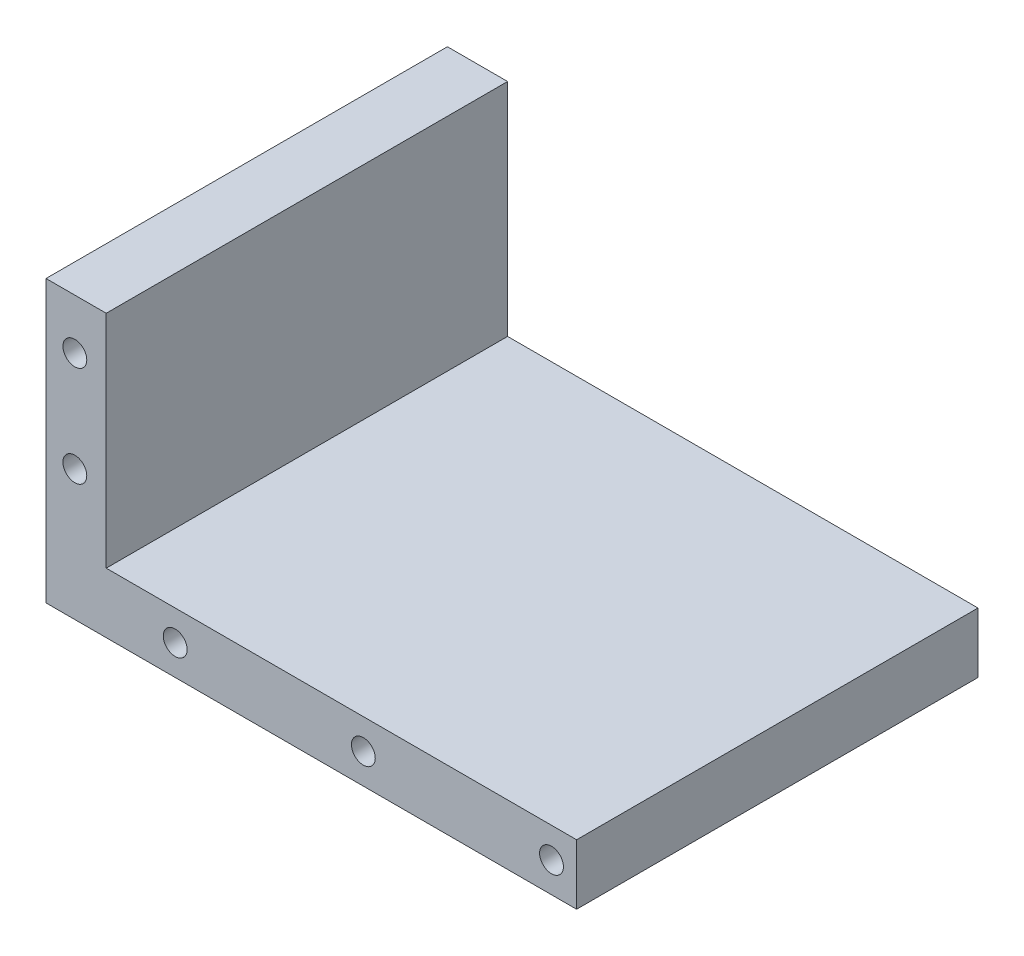
ISO-10303-21;
HEADER;
FILE_DESCRIPTION(('STEP AP214'),'2;1');
FILE_NAME('part.step','',(''),(''),'','','');
FILE_SCHEMA(('AUTOMOTIVE_DESIGN { 1 0 10303 214 1 1 1 1 }'));
ENDSEC;
DATA;
#1=APPLICATION_CONTEXT('core data for automotive mechanical design processes');
#2=APPLICATION_PROTOCOL_DEFINITION('international standard','automotive_design',2000,#1);
#3=PRODUCT_CONTEXT('',#1,'mechanical');
#4=PRODUCT('Part','Part','',(#3));
#5=PRODUCT_RELATED_PRODUCT_CATEGORY('part','',(#4));
#6=PRODUCT_DEFINITION_FORMATION('','',#4);
#7=PRODUCT_DEFINITION_CONTEXT('part definition',#1,'design');
#8=PRODUCT_DEFINITION('design','',#6,#7);
#9=PRODUCT_DEFINITION_SHAPE('','',#8);
#10=(LENGTH_UNIT() NAMED_UNIT(*) SI_UNIT(.MILLI.,.METRE.));
#11=(NAMED_UNIT(*) PLANE_ANGLE_UNIT() SI_UNIT($,.RADIAN.));
#12=(NAMED_UNIT(*) SI_UNIT($,.STERADIAN.) SOLID_ANGLE_UNIT());
#13=UNCERTAINTY_MEASURE_WITH_UNIT(LENGTH_MEASURE(1.E-05),#10,'distance_accuracy_value','');
#14=(GEOMETRIC_REPRESENTATION_CONTEXT(3) GLOBAL_UNCERTAINTY_ASSIGNED_CONTEXT((#13)) GLOBAL_UNIT_ASSIGNED_CONTEXT((#10,
#11,#12)) REPRESENTATION_CONTEXT('',''));
#15=CARTESIAN_POINT('',(0.,0.,0.));
#16=DIRECTION('',(0.,0.,1.));
#17=DIRECTION('',(1.,0.,0.));
#18=AXIS2_PLACEMENT_3D('',#15,#16,#17);
#19=CARTESIAN_POINT('',(0.,0.,32.));
#20=DIRECTION('',(0.,0.,-1.));
#21=DIRECTION('',(-1.,0.,0.));
#22=AXIS2_PLACEMENT_3D('',#19,#20,#21);
#23=PLANE('',#22);
#24=DIRECTION('',(-1.,0.,0.));
#25=VECTOR('',#24,1.);
#26=CARTESIAN_POINT('',(-4.8,17.6,32.));
#27=LINE('',#26,#25);
#28=CARTESIAN_POINT('',(0.,17.6,32.));
#29=VERTEX_POINT('',#28);
#30=CARTESIAN_POINT('',(-4.8,17.6,32.));
#31=VERTEX_POINT('',#30);
#32=EDGE_CURVE('E146',#29,#31,#27,.T.);
#33=ORIENTED_EDGE('',*,*,#32,.T.);
#34=DIRECTION('',(0.,-1.,0.));
#35=VECTOR('',#34,1.);
#36=CARTESIAN_POINT('',(-4.8,-4.80000000000001,32.));
#37=LINE('',#36,#35);
#38=CARTESIAN_POINT('',(-4.8,-4.80000000000001,32.));
#39=VERTEX_POINT('',#38);
#40=EDGE_CURVE('E94',#31,#39,#37,.T.);
#41=ORIENTED_EDGE('',*,*,#40,.T.);
#42=DIRECTION('',(1.,0.,0.));
#43=VECTOR('',#42,1.);
#44=CARTESIAN_POINT('',(37.5,-4.8,32.));
#45=LINE('',#44,#43);
#46=CARTESIAN_POINT('',(37.5,-4.8,32.));
#47=VERTEX_POINT('',#46);
#48=EDGE_CURVE('E107',#39,#47,#45,.T.);
#49=ORIENTED_EDGE('',*,*,#48,.T.);
#50=DIRECTION('',(0.,1.,0.));
#51=VECTOR('',#50,1.);
#52=CARTESIAN_POINT('',(37.5,0.,32.));
#53=LINE('',#52,#51);
#54=CARTESIAN_POINT('',(37.5,0.,32.));
#55=VERTEX_POINT('',#54);
#56=EDGE_CURVE('E101',#47,#55,#53,.T.);
#57=ORIENTED_EDGE('',*,*,#56,.T.);
#58=DIRECTION('',(-1.,0.,0.));
#59=VECTOR('',#58,1.);
#60=CARTESIAN_POINT('',(0.,0.,32.));
#61=LINE('',#60,#59);
#62=CARTESIAN_POINT('',(0.,0.,32.));
#63=VERTEX_POINT('',#62);
#64=EDGE_CURVE('E105',#55,#63,#61,.T.);
#65=ORIENTED_EDGE('',*,*,#64,.T.);
#66=DIRECTION('',(0.,1.,0.));
#67=VECTOR('',#66,1.);
#68=CARTESIAN_POINT('',(0.,17.6,32.));
#69=LINE('',#68,#67);
#70=EDGE_CURVE('E57',#63,#29,#69,.T.);
#71=ORIENTED_EDGE('',*,*,#70,.T.);
#72=EDGE_LOOP('',(#33,#41,#49,#57,#65,#71));
#73=FACE_BOUND('',#72,.T.);
#74=CARTESIAN_POINT('',(-2.5,13.6,32.));
#75=DIRECTION('',(0.,0.,1.));
#76=DIRECTION('',(1.,0.,0.));
#77=AXIS2_PLACEMENT_3D('',#74,#75,#76);
#78=CIRCLE('',#77,0.95);
#79=CARTESIAN_POINT('',(-1.55,13.6,32.));
#80=VERTEX_POINT('',#79);
#81=EDGE_CURVE('E134',#80,#80,#78,.T.);
#82=ORIENTED_EDGE('',*,*,#81,.F.);
#83=EDGE_LOOP('',(#82));
#84=FACE_BOUND('',#83,.T.);
#85=CARTESIAN_POINT('',(35.5,-2.4,32.));
#86=DIRECTION('',(0.,0.,1.));
#87=DIRECTION('',(1.,0.,0.));
#88=AXIS2_PLACEMENT_3D('',#85,#86,#87);
#89=CIRCLE('',#88,0.950000000000001);
#90=CARTESIAN_POINT('',(36.45,-2.4,32.));
#91=VERTEX_POINT('',#90);
#92=EDGE_CURVE('E230',#91,#91,#89,.T.);
#93=ORIENTED_EDGE('',*,*,#92,.F.);
#94=EDGE_LOOP('',(#93));
#95=FACE_BOUND('',#94,.T.);
#96=CARTESIAN_POINT('',(20.5,-2.4000000000001,32.));
#97=DIRECTION('',(0.,0.,1.));
#98=DIRECTION('',(1.,0.,0.));
#99=AXIS2_PLACEMENT_3D('',#96,#97,#98);
#100=CIRCLE('',#99,0.950000000000001);
#101=CARTESIAN_POINT('',(21.45,-2.4000000000001,32.));
#102=VERTEX_POINT('',#101);
#103=EDGE_CURVE('E222',#102,#102,#100,.T.);
#104=ORIENTED_EDGE('',*,*,#103,.F.);
#105=EDGE_LOOP('',(#104));
#106=FACE_BOUND('',#105,.T.);
#107=CARTESIAN_POINT('',(5.5,-2.40000000000021,32.));
#108=DIRECTION('',(0.,0.,1.));
#109=DIRECTION('',(1.,0.,0.));
#110=AXIS2_PLACEMENT_3D('',#107,#108,#109);
#111=CIRCLE('',#110,0.95);
#112=CARTESIAN_POINT('',(6.45,-2.40000000000021,32.));
#113=VERTEX_POINT('',#112);
#114=EDGE_CURVE('E214',#113,#113,#111,.T.);
#115=ORIENTED_EDGE('',*,*,#114,.F.);
#116=EDGE_LOOP('',(#115));
#117=FACE_BOUND('',#116,.T.);
#118=CARTESIAN_POINT('',(-2.49999999999992,5.6,32.));
#119=DIRECTION('',(0.,0.,1.));
#120=DIRECTION('',(1.,0.,0.));
#121=AXIS2_PLACEMENT_3D('',#118,#119,#120);
#122=CIRCLE('',#121,0.95);
#123=CARTESIAN_POINT('',(-1.54999999999992,5.6,32.));
#124=VERTEX_POINT('',#123);
#125=EDGE_CURVE('E203',#124,#124,#122,.T.);
#126=ORIENTED_EDGE('',*,*,#125,.F.);
#127=EDGE_LOOP('',(#126));
#128=FACE_BOUND('',#127,.T.);
#129=ADVANCED_FACE('F39',(#73,#84,#95,#106,#117,#128),#23,.F.);
#130=CARTESIAN_POINT('',(0.,0.,0.));
#131=DIRECTION('',(0.,0.,-1.));
#132=DIRECTION('',(-1.,0.,0.));
#133=AXIS2_PLACEMENT_3D('',#130,#131,#132);
#134=PLANE('',#133);
#135=CARTESIAN_POINT('',(5.5,-2.40000000000021,0.));
#136=DIRECTION('',(0.,0.,1.));
#137=DIRECTION('',(1.,0.,0.));
#138=AXIS2_PLACEMENT_3D('',#135,#136,#137);
#139=CIRCLE('',#138,0.95);
#140=CARTESIAN_POINT('',(6.45,-2.40000000000021,0.));
#141=VERTEX_POINT('',#140);
#142=EDGE_CURVE('E211',#141,#141,#139,.T.);
#143=ORIENTED_EDGE('',*,*,#142,.T.);
#144=EDGE_LOOP('',(#143));
#145=FACE_BOUND('',#144,.T.);
#146=CARTESIAN_POINT('',(35.5,-2.4,0.));
#147=DIRECTION('',(0.,0.,1.));
#148=DIRECTION('',(1.,0.,0.));
#149=AXIS2_PLACEMENT_3D('',#146,#147,#148);
#150=CIRCLE('',#149,0.950000000000001);
#151=CARTESIAN_POINT('',(36.45,-2.4,0.));
#152=VERTEX_POINT('',#151);
#153=EDGE_CURVE('E226',#152,#152,#150,.T.);
#154=ORIENTED_EDGE('',*,*,#153,.T.);
#155=EDGE_LOOP('',(#154));
#156=FACE_BOUND('',#155,.T.);
#157=DIRECTION('',(-1.,0.,0.));
#158=VECTOR('',#157,1.);
#159=CARTESIAN_POINT('',(-4.8,17.6,0.));
#160=LINE('',#159,#158);
#161=CARTESIAN_POINT('',(0.,17.6,0.));
#162=VERTEX_POINT('',#161);
#163=CARTESIAN_POINT('',(-4.8,17.6,0.));
#164=VERTEX_POINT('',#163);
#165=EDGE_CURVE('E129',#162,#164,#160,.T.);
#166=ORIENTED_EDGE('',*,*,#165,.F.);
#167=DIRECTION('',(0.,1.,0.));
#168=VECTOR('',#167,1.);
#169=CARTESIAN_POINT('',(0.,17.6,0.));
#170=LINE('',#169,#168);
#171=CARTESIAN_POINT('',(0.,0.,0.));
#172=VERTEX_POINT('',#171);
#173=EDGE_CURVE('E86',#172,#162,#170,.T.);
#174=ORIENTED_EDGE('',*,*,#173,.F.);
#175=DIRECTION('',(-1.,0.,0.));
#176=VECTOR('',#175,1.);
#177=CARTESIAN_POINT('',(0.,0.,0.));
#178=LINE('',#177,#176);
#179=CARTESIAN_POINT('',(37.5,0.,0.));
#180=VERTEX_POINT('',#179);
#181=EDGE_CURVE('E80',#180,#172,#178,.T.);
#182=ORIENTED_EDGE('',*,*,#181,.F.);
#183=DIRECTION('',(0.,1.,0.));
#184=VECTOR('',#183,1.);
#185=CARTESIAN_POINT('',(37.5,0.,0.));
#186=LINE('',#185,#184);
#187=CARTESIAN_POINT('',(37.5,-4.8,0.));
#188=VERTEX_POINT('',#187);
#189=EDGE_CURVE('E116',#188,#180,#186,.T.);
#190=ORIENTED_EDGE('',*,*,#189,.F.);
#191=DIRECTION('',(1.,0.,0.));
#192=VECTOR('',#191,1.);
#193=CARTESIAN_POINT('',(37.5,-4.8,0.));
#194=LINE('',#193,#192);
#195=CARTESIAN_POINT('',(-4.8,-4.80000000000001,0.));
#196=VERTEX_POINT('',#195);
#197=EDGE_CURVE('E137',#196,#188,#194,.T.);
#198=ORIENTED_EDGE('',*,*,#197,.F.);
#199=DIRECTION('',(0.,-1.,0.));
#200=VECTOR('',#199,1.);
#201=CARTESIAN_POINT('',(-4.8,-4.80000000000001,0.));
#202=LINE('',#201,#200);
#203=EDGE_CURVE('E133',#164,#196,#202,.T.);
#204=ORIENTED_EDGE('',*,*,#203,.F.);
#205=EDGE_LOOP('',(#166,#174,#182,#190,#198,#204));
#206=FACE_BOUND('',#205,.T.);
#207=CARTESIAN_POINT('',(-2.5,13.6,0.));
#208=DIRECTION('',(0.,0.,1.));
#209=DIRECTION('',(1.,0.,0.));
#210=AXIS2_PLACEMENT_3D('',#207,#208,#209);
#211=CIRCLE('',#210,0.95);
#212=CARTESIAN_POINT('',(-1.55,13.6,0.));
#213=VERTEX_POINT('',#212);
#214=EDGE_CURVE('E234',#213,#213,#211,.T.);
#215=ORIENTED_EDGE('',*,*,#214,.T.);
#216=EDGE_LOOP('',(#215));
#217=FACE_BOUND('',#216,.T.);
#218=CARTESIAN_POINT('',(20.5,-2.4000000000001,0.));
#219=DIRECTION('',(0.,0.,1.));
#220=DIRECTION('',(1.,0.,0.));
#221=AXIS2_PLACEMENT_3D('',#218,#219,#220);
#222=CIRCLE('',#221,0.950000000000001);
#223=CARTESIAN_POINT('',(21.45,-2.4000000000001,0.));
#224=VERTEX_POINT('',#223);
#225=EDGE_CURVE('E218',#224,#224,#222,.T.);
#226=ORIENTED_EDGE('',*,*,#225,.T.);
#227=EDGE_LOOP('',(#226));
#228=FACE_BOUND('',#227,.T.);
#229=CARTESIAN_POINT('',(-2.49999999999992,5.6,0.));
#230=DIRECTION('',(0.,0.,1.));
#231=DIRECTION('',(1.,0.,0.));
#232=AXIS2_PLACEMENT_3D('',#229,#230,#231);
#233=CIRCLE('',#232,0.95);
#234=CARTESIAN_POINT('',(-1.54999999999992,5.6,0.));
#235=VERTEX_POINT('',#234);
#236=EDGE_CURVE('E206',#235,#235,#233,.T.);
#237=ORIENTED_EDGE('',*,*,#236,.T.);
#238=EDGE_LOOP('',(#237));
#239=FACE_BOUND('',#238,.T.);
#240=ADVANCED_FACE('F159',(#145,#156,#206,#217,#228,#239),#134,.T.);
#241=CARTESIAN_POINT('',(-4.8,17.6,32.));
#242=DIRECTION('',(0.,-1.,0.));
#243=DIRECTION('',(0.,0.,-1.));
#244=AXIS2_PLACEMENT_3D('',#241,#242,#243);
#245=PLANE('',#244);
#246=ORIENTED_EDGE('',*,*,#165,.T.);
#247=DIRECTION('',(0.,0.,-1.));
#248=VECTOR('',#247,1.);
#249=CARTESIAN_POINT('',(-4.8,17.6,32.));
#250=LINE('',#249,#248);
#251=EDGE_CURVE('E11',#31,#164,#250,.T.);
#252=ORIENTED_EDGE('',*,*,#251,.F.);
#253=ORIENTED_EDGE('',*,*,#32,.F.);
#254=DIRECTION('',(0.,0.,-1.));
#255=VECTOR('',#254,1.);
#256=CARTESIAN_POINT('',(0.,17.6,32.));
#257=LINE('',#256,#255);
#258=EDGE_CURVE('E125',#29,#162,#257,.T.);
#259=ORIENTED_EDGE('',*,*,#258,.T.);
#260=EDGE_LOOP('',(#246,#252,#253,#259));
#261=FACE_BOUND('',#260,.T.);
#262=ADVANCED_FACE('F41',(#261),#245,.F.);
#263=CARTESIAN_POINT('',(-4.8,-4.80000000000001,32.));
#264=DIRECTION('',(1.,0.,0.));
#265=DIRECTION('',(0.,1.,0.));
#266=AXIS2_PLACEMENT_3D('',#263,#264,#265);
#267=PLANE('',#266);
#268=ORIENTED_EDGE('',*,*,#203,.T.);
#269=DIRECTION('',(0.,0.,-1.));
#270=VECTOR('',#269,1.);
#271=CARTESIAN_POINT('',(-4.8,-4.80000000000001,32.));
#272=LINE('',#271,#270);
#273=EDGE_CURVE('E49',#39,#196,#272,.T.);
#274=ORIENTED_EDGE('',*,*,#273,.F.);
#275=ORIENTED_EDGE('',*,*,#40,.F.);
#276=ORIENTED_EDGE('',*,*,#251,.T.);
#277=EDGE_LOOP('',(#268,#274,#275,#276));
#278=FACE_BOUND('',#277,.T.);
#279=ADVANCED_FACE('F309',(#278),#267,.F.);
#280=CARTESIAN_POINT('',(37.5,-4.8,32.));
#281=DIRECTION('',(0.,1.,0.));
#282=DIRECTION('',(-1.,0.,0.));
#283=AXIS2_PLACEMENT_3D('',#280,#281,#282);
#284=PLANE('',#283);
#285=ORIENTED_EDGE('',*,*,#197,.T.);
#286=DIRECTION('',(0.,0.,-1.));
#287=VECTOR('',#286,1.);
#288=CARTESIAN_POINT('',(37.5,-4.8,32.));
#289=LINE('',#288,#287);
#290=EDGE_CURVE('E118',#47,#188,#289,.T.);
#291=ORIENTED_EDGE('',*,*,#290,.F.);
#292=ORIENTED_EDGE('',*,*,#48,.F.);
#293=ORIENTED_EDGE('',*,*,#273,.T.);
#294=EDGE_LOOP('',(#285,#291,#292,#293));
#295=FACE_BOUND('',#294,.T.);
#296=ADVANCED_FACE('F156',(#295),#284,.F.);
#297=CARTESIAN_POINT('',(37.5,0.,32.));
#298=DIRECTION('',(-1.,0.,0.));
#299=DIRECTION('',(0.,0.,1.));
#300=AXIS2_PLACEMENT_3D('',#297,#298,#299);
#301=PLANE('',#300);
#302=ORIENTED_EDGE('',*,*,#189,.T.);
#303=DIRECTION('',(0.,0.,-1.));
#304=VECTOR('',#303,1.);
#305=CARTESIAN_POINT('',(37.5,0.,32.));
#306=LINE('',#305,#304);
#307=EDGE_CURVE('E113',#55,#180,#306,.T.);
#308=ORIENTED_EDGE('',*,*,#307,.F.);
#309=ORIENTED_EDGE('',*,*,#56,.F.);
#310=ORIENTED_EDGE('',*,*,#290,.T.);
#311=EDGE_LOOP('',(#302,#308,#309,#310));
#312=FACE_BOUND('',#311,.T.);
#313=ADVANCED_FACE('F114',(#312),#301,.F.);
#314=CARTESIAN_POINT('',(0.,0.,32.));
#315=DIRECTION('',(0.,-1.,0.));
#316=DIRECTION('',(0.,0.,-1.));
#317=AXIS2_PLACEMENT_3D('',#314,#315,#316);
#318=PLANE('',#317);
#319=ORIENTED_EDGE('',*,*,#181,.T.);
#320=DIRECTION('',(0.,0.,-1.));
#321=VECTOR('',#320,1.);
#322=CARTESIAN_POINT('',(0.,0.,32.));
#323=LINE('',#322,#321);
#324=EDGE_CURVE('E119',#63,#172,#323,.T.);
#325=ORIENTED_EDGE('',*,*,#324,.F.);
#326=ORIENTED_EDGE('',*,*,#64,.F.);
#327=ORIENTED_EDGE('',*,*,#307,.T.);
#328=EDGE_LOOP('',(#319,#325,#326,#327));
#329=FACE_BOUND('',#328,.T.);
#330=ADVANCED_FACE('F121',(#329),#318,.F.);
#331=CARTESIAN_POINT('',(0.,17.6,32.));
#332=DIRECTION('',(-1.,0.,0.));
#333=DIRECTION('',(0.,-1.,0.));
#334=AXIS2_PLACEMENT_3D('',#331,#332,#333);
#335=PLANE('',#334);
#336=ORIENTED_EDGE('',*,*,#173,.T.);
#337=ORIENTED_EDGE('',*,*,#258,.F.);
#338=ORIENTED_EDGE('',*,*,#70,.F.);
#339=ORIENTED_EDGE('',*,*,#324,.T.);
#340=EDGE_LOOP('',(#336,#337,#338,#339));
#341=FACE_BOUND('',#340,.T.);
#342=ADVANCED_FACE('F164',(#341),#335,.F.);
#343=CARTESIAN_POINT('',(-2.5,13.6,32.));
#344=DIRECTION('',(0.,0.,-1.));
#345=DIRECTION('',(-1.,0.,0.));
#346=AXIS2_PLACEMENT_3D('',#343,#344,#345);
#347=CYLINDRICAL_SURFACE('',#346,0.95);
#348=ORIENTED_EDGE('',*,*,#81,.T.);
#349=EDGE_LOOP('',(#348));
#350=FACE_BOUND('',#349,.T.);
#351=ORIENTED_EDGE('',*,*,#214,.F.);
#352=EDGE_LOOP('',(#351));
#353=FACE_BOUND('',#352,.T.);
#354=ADVANCED_FACE('F166',(#350,#353),#347,.F.);
#355=CARTESIAN_POINT('',(35.5,-2.4,32.));
#356=DIRECTION('',(0.,0.,-1.));
#357=DIRECTION('',(-1.,0.,0.));
#358=AXIS2_PLACEMENT_3D('',#355,#356,#357);
#359=CYLINDRICAL_SURFACE('',#358,0.950000000000001);
#360=ORIENTED_EDGE('',*,*,#92,.T.);
#361=EDGE_LOOP('',(#360));
#362=FACE_BOUND('',#361,.T.);
#363=ORIENTED_EDGE('',*,*,#153,.F.);
#364=EDGE_LOOP('',(#363));
#365=FACE_BOUND('',#364,.T.);
#366=ADVANCED_FACE('F172',(#362,#365),#359,.F.);
#367=CARTESIAN_POINT('',(20.5,-2.4000000000001,32.));
#368=DIRECTION('',(0.,0.,-1.));
#369=DIRECTION('',(-1.,0.,0.));
#370=AXIS2_PLACEMENT_3D('',#367,#368,#369);
#371=CYLINDRICAL_SURFACE('',#370,0.950000000000001);
#372=ORIENTED_EDGE('',*,*,#103,.T.);
#373=EDGE_LOOP('',(#372));
#374=FACE_BOUND('',#373,.T.);
#375=ORIENTED_EDGE('',*,*,#225,.F.);
#376=EDGE_LOOP('',(#375));
#377=FACE_BOUND('',#376,.T.);
#378=ADVANCED_FACE('F186',(#374,#377),#371,.F.);
#379=CARTESIAN_POINT('',(5.5,-2.40000000000021,32.));
#380=DIRECTION('',(0.,0.,-1.));
#381=DIRECTION('',(-1.,0.,0.));
#382=AXIS2_PLACEMENT_3D('',#379,#380,#381);
#383=CYLINDRICAL_SURFACE('',#382,0.95);
#384=ORIENTED_EDGE('',*,*,#114,.T.);
#385=EDGE_LOOP('',(#384));
#386=FACE_BOUND('',#385,.T.);
#387=ORIENTED_EDGE('',*,*,#142,.F.);
#388=EDGE_LOOP('',(#387));
#389=FACE_BOUND('',#388,.T.);
#390=ADVANCED_FACE('F190',(#386,#389),#383,.F.);
#391=CARTESIAN_POINT('',(-2.49999999999992,5.6,32.));
#392=DIRECTION('',(0.,0.,-1.));
#393=DIRECTION('',(-1.,0.,0.));
#394=AXIS2_PLACEMENT_3D('',#391,#392,#393);
#395=CYLINDRICAL_SURFACE('',#394,0.95);
#396=ORIENTED_EDGE('',*,*,#125,.T.);
#397=EDGE_LOOP('',(#396));
#398=FACE_BOUND('',#397,.T.);
#399=ORIENTED_EDGE('',*,*,#236,.F.);
#400=EDGE_LOOP('',(#399));
#401=FACE_BOUND('',#400,.T.);
#402=ADVANCED_FACE('F194',(#398,#401),#395,.F.);
#403=CLOSED_SHELL('',(#129,#240,#262,#279,#296,#313,#330,#342,#354,#366,#378,#390,#402));
#404=MANIFOLD_SOLID_BREP('B2',#403);
#405=ADVANCED_BREP_SHAPE_REPRESENTATION('',(#18,#404),#14);
#406=SHAPE_DEFINITION_REPRESENTATION(#9,#405);
ENDSEC;
END-ISO-10303-21;
